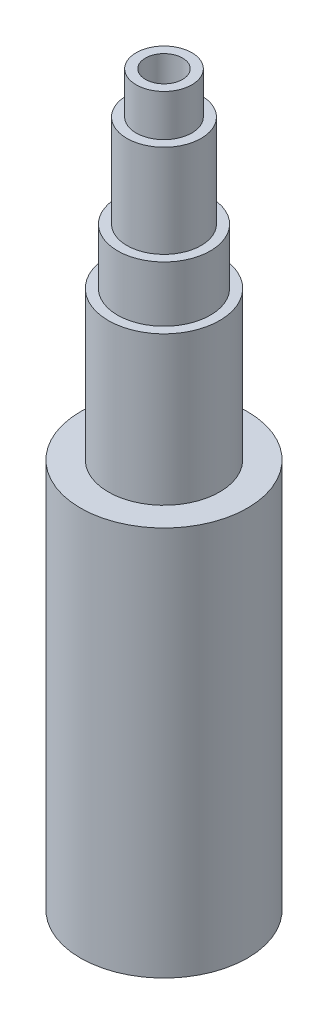
ISO-10303-21;
HEADER;
FILE_DESCRIPTION(('STEP AP214'),'2;1');
FILE_NAME('part.step','',(''),(''),'','','');
FILE_SCHEMA(('AUTOMOTIVE_DESIGN { 1 0 10303 214 1 1 1 1 }'));
ENDSEC;
DATA;
#1=APPLICATION_CONTEXT('core data for automotive mechanical design processes');
#2=APPLICATION_PROTOCOL_DEFINITION('international standard','automotive_design',2000,#1);
#3=PRODUCT_CONTEXT('',#1,'mechanical');
#4=PRODUCT('Part','Part','',(#3));
#5=PRODUCT_RELATED_PRODUCT_CATEGORY('part','',(#4));
#6=PRODUCT_DEFINITION_FORMATION('','',#4);
#7=PRODUCT_DEFINITION_CONTEXT('part definition',#1,'design');
#8=PRODUCT_DEFINITION('design','',#6,#7);
#9=PRODUCT_DEFINITION_SHAPE('','',#8);
#10=(LENGTH_UNIT() NAMED_UNIT(*) SI_UNIT(.MILLI.,.METRE.));
#11=(NAMED_UNIT(*) PLANE_ANGLE_UNIT() SI_UNIT($,.RADIAN.));
#12=(NAMED_UNIT(*) SI_UNIT($,.STERADIAN.) SOLID_ANGLE_UNIT());
#13=UNCERTAINTY_MEASURE_WITH_UNIT(LENGTH_MEASURE(1.E-05),#10,'distance_accuracy_value','');
#14=(GEOMETRIC_REPRESENTATION_CONTEXT(3) GLOBAL_UNCERTAINTY_ASSIGNED_CONTEXT((#13)) GLOBAL_UNIT_ASSIGNED_CONTEXT((#10,
#11,#12)) REPRESENTATION_CONTEXT('',''));
#15=CARTESIAN_POINT('',(0.,0.,0.));
#16=DIRECTION('',(0.,0.,1.));
#17=DIRECTION('',(1.,0.,0.));
#18=AXIS2_PLACEMENT_3D('',#15,#16,#17);
#19=CARTESIAN_POINT('',(0.,42.,0.));
#20=DIRECTION('',(0.,-1.,0.));
#21=DIRECTION('',(0.,0.,-1.));
#22=AXIS2_PLACEMENT_3D('',#19,#20,#21);
#23=CYLINDRICAL_SURFACE('',#22,9.);
#24=CARTESIAN_POINT('',(0.,42.,0.));
#25=DIRECTION('',(0.,1.,0.));
#26=DIRECTION('',(0.,0.,1.));
#27=AXIS2_PLACEMENT_3D('',#24,#25,#26);
#28=CIRCLE('',#27,9.);
#29=CARTESIAN_POINT('',(0.,42.,-9.));
#30=VERTEX_POINT('',#29);
#31=EDGE_CURVE('E10',#30,#30,#28,.T.);
#32=CARTESIAN_POINT('',(0.,0.,0.));
#33=DIRECTION('',(0.,1.,0.));
#34=DIRECTION('',(0.,0.,1.));
#35=AXIS2_PLACEMENT_3D('',#32,#33,#34);
#36=CIRCLE('',#35,9.);
#37=CARTESIAN_POINT('',(0.,0.,-9.));
#38=VERTEX_POINT('',#37);
#39=EDGE_CURVE('E36',#38,#38,#36,.T.);
#40=CARTESIAN_POINT('',(0.,42.,-9.));
#41=CARTESIAN_POINT('',(0.,41.5625,-9.));
#42=CARTESIAN_POINT('',(0.,41.125,-9.));
#43=CARTESIAN_POINT('',(0.,40.25,-9.));
#44=CARTESIAN_POINT('',(0.,39.8125,-9.));
#45=CARTESIAN_POINT('',(0.,38.9375,-9.));
#46=CARTESIAN_POINT('',(0.,38.5,-9.));
#47=CARTESIAN_POINT('',(0.,37.625,-9.));
#48=CARTESIAN_POINT('',(0.,37.1875,-9.));
#49=CARTESIAN_POINT('',(0.,36.3125,-9.));
#50=CARTESIAN_POINT('',(0.,35.875,-9.));
#51=CARTESIAN_POINT('',(0.,35.,-9.));
#52=CARTESIAN_POINT('',(0.,34.5625,-9.));
#53=CARTESIAN_POINT('',(0.,33.6875,-9.));
#54=CARTESIAN_POINT('',(0.,33.25,-9.));
#55=CARTESIAN_POINT('',(0.,32.375,-9.));
#56=CARTESIAN_POINT('',(0.,31.9375,-9.));
#57=CARTESIAN_POINT('',(0.,31.0625,-9.));
#58=CARTESIAN_POINT('',(0.,30.625,-9.));
#59=CARTESIAN_POINT('',(0.,29.75,-9.));
#60=CARTESIAN_POINT('',(0.,29.3125,-9.));
#61=CARTESIAN_POINT('',(0.,28.4375,-9.));
#62=CARTESIAN_POINT('',(0.,28.,-9.));
#63=CARTESIAN_POINT('',(0.,27.125,-9.));
#64=CARTESIAN_POINT('',(0.,26.6875,-9.));
#65=CARTESIAN_POINT('',(0.,25.8125,-9.));
#66=CARTESIAN_POINT('',(0.,25.375,-9.));
#67=CARTESIAN_POINT('',(0.,24.5,-9.));
#68=CARTESIAN_POINT('',(0.,24.0625,-9.));
#69=CARTESIAN_POINT('',(0.,23.1875,-9.));
#70=CARTESIAN_POINT('',(0.,22.75,-9.));
#71=CARTESIAN_POINT('',(0.,21.875,-9.));
#72=CARTESIAN_POINT('',(0.,21.4375,-9.));
#73=CARTESIAN_POINT('',(0.,20.5625,-9.));
#74=CARTESIAN_POINT('',(0.,20.125,-9.));
#75=CARTESIAN_POINT('',(0.,19.25,-9.));
#76=CARTESIAN_POINT('',(0.,18.8125,-9.));
#77=CARTESIAN_POINT('',(0.,17.9375,-9.));
#78=CARTESIAN_POINT('',(0.,17.5,-9.));
#79=CARTESIAN_POINT('',(0.,16.625,-9.));
#80=CARTESIAN_POINT('',(0.,16.1875,-9.));
#81=CARTESIAN_POINT('',(0.,15.3125,-9.));
#82=CARTESIAN_POINT('',(0.,14.875,-9.));
#83=CARTESIAN_POINT('',(0.,14.,-9.));
#84=CARTESIAN_POINT('',(0.,13.5625,-9.));
#85=CARTESIAN_POINT('',(0.,12.6875,-9.));
#86=CARTESIAN_POINT('',(0.,12.25,-9.));
#87=CARTESIAN_POINT('',(0.,11.375,-9.));
#88=CARTESIAN_POINT('',(0.,10.9375,-9.));
#89=CARTESIAN_POINT('',(0.,10.0625,-9.));
#90=CARTESIAN_POINT('',(0.,9.625,-9.));
#91=CARTESIAN_POINT('',(0.,8.75,-9.));
#92=CARTESIAN_POINT('',(0.,8.3125,-9.));
#93=CARTESIAN_POINT('',(0.,7.4375,-9.));
#94=CARTESIAN_POINT('',(0.,7.,-9.));
#95=CARTESIAN_POINT('',(0.,6.125,-9.));
#96=CARTESIAN_POINT('',(0.,5.6875,-9.));
#97=CARTESIAN_POINT('',(0.,4.8125,-9.));
#98=CARTESIAN_POINT('',(0.,4.375,-9.));
#99=CARTESIAN_POINT('',(0.,3.5,-9.));
#100=CARTESIAN_POINT('',(0.,3.0625,-9.));
#101=CARTESIAN_POINT('',(0.,2.1875,-9.));
#102=CARTESIAN_POINT('',(0.,1.75,-9.));
#103=CARTESIAN_POINT('',(0.,0.875000000000001,-9.));
#104=CARTESIAN_POINT('',(0.,0.4375,-9.));
#105=CARTESIAN_POINT('',(0.,0.,-9.));
#106=B_SPLINE_CURVE_WITH_KNOTS('',3,(#40,#41,#42,#43,#44,#45,#46,#47,#48,#49,#50,#51,#52,#53,
#54,#55,#56,#57,#58,#59,#60,#61,#62,#63,#64,#65,#66,#67,#68,#69,#70,#71,#72,#73,#74,#75,#76,#77,
#78,#79,#80,#81,#82,#83,#84,#85,#86,#87,#88,#89,#90,#91,#92,#93,#94,#95,#96,#97,#98,#99,#100,
#101,#102,#103,#104,#105),.UNSPECIFIED.,.F.,.F.,(4,2,2,2,2,2,2,2,2,2,2,2,2,2,2,2,2,2,2,2,2,2,2,
2,2,2,2,2,2,2,2,2,4),(0.,1.3125,2.625,3.9375,5.25,6.56250000000001,7.875,9.1875,10.5,11.8125,
13.125,14.4375,15.75,17.0625,18.375,19.6875,21.,22.3125,23.625,24.9375,26.25,27.5625,28.875,
30.1875,31.5,32.8125,34.125,35.4375,36.75,38.0625,39.375,40.6875,42.),.UNSPECIFIED.);
#107=EDGE_CURVE('BSEAM33',#30,#38,#106,.T.);
#108=ORIENTED_EDGE('',*,*,#31,.F.);
#109=ORIENTED_EDGE('',*,*,#39,.T.);
#110=ORIENTED_EDGE('',*,*,#107,.T.);
#111=ORIENTED_EDGE('',*,*,#107,.F.);
#112=EDGE_LOOP('',(#108,#110,#109,#111));
#113=FACE_BOUND('',#112,.T.);
#114=ADVANCED_FACE('F33',(#113),#23,.T.);
#115=CARTESIAN_POINT('',(0.,42.,0.));
#116=DIRECTION('',(0.,1.,0.));
#117=DIRECTION('',(0.,0.,1.));
#118=AXIS2_PLACEMENT_3D('',#115,#116,#117);
#119=PLANE('',#118);
#120=CARTESIAN_POINT('',(0.,42.,0.));
#121=DIRECTION('',(0.,1.,0.));
#122=DIRECTION('',(0.,0.,1.));
#123=AXIS2_PLACEMENT_3D('',#120,#121,#122);
#124=CIRCLE('',#123,6.);
#125=CARTESIAN_POINT('',(0.,42.,6.));
#126=VERTEX_POINT('',#125);
#127=EDGE_CURVE('E45',#126,#126,#124,.T.);
#128=ORIENTED_EDGE('',*,*,#127,.F.);
#129=EDGE_LOOP('',(#128));
#130=FACE_BOUND('',#129,.T.);
#131=ORIENTED_EDGE('',*,*,#31,.T.);
#132=EDGE_LOOP('',(#131));
#133=FACE_BOUND('',#132,.T.);
#134=ADVANCED_FACE('F94',(#130,#133),#119,.T.);
#135=CARTESIAN_POINT('',(0.,0.,0.));
#136=DIRECTION('',(0.,1.,0.));
#137=DIRECTION('',(0.,0.,1.));
#138=AXIS2_PLACEMENT_3D('',#135,#136,#137);
#139=PLANE('',#138);
#140=CARTESIAN_POINT('',(0.,0.,0.));
#141=DIRECTION('',(0.,-1.,0.));
#142=DIRECTION('',(0.,0.,-1.));
#143=AXIS2_PLACEMENT_3D('',#140,#141,#142);
#144=CIRCLE('',#143,4.);
#145=CARTESIAN_POINT('',(0.,0.,-4.));
#146=VERTEX_POINT('',#145);
#147=EDGE_CURVE('E75',#146,#146,#144,.T.);
#148=ORIENTED_EDGE('',*,*,#147,.F.);
#149=EDGE_LOOP('',(#148));
#150=FACE_BOUND('',#149,.T.);
#151=ORIENTED_EDGE('',*,*,#39,.F.);
#152=EDGE_LOOP('',(#151));
#153=FACE_BOUND('',#152,.T.);
#154=ADVANCED_FACE('F90',(#150,#153),#139,.F.);
#155=CARTESIAN_POINT('',(0.,58.,0.));
#156=DIRECTION('',(0.,-1.,0.));
#157=DIRECTION('',(0.,0.,-1.));
#158=AXIS2_PLACEMENT_3D('',#155,#156,#157);
#159=CYLINDRICAL_SURFACE('',#158,6.);
#160=CARTESIAN_POINT('',(0.,58.,0.));
#161=DIRECTION('',(0.,1.,0.));
#162=DIRECTION('',(0.,0.,1.));
#163=AXIS2_PLACEMENT_3D('',#160,#161,#162);
#164=CIRCLE('',#163,6.);
#165=CARTESIAN_POINT('',(0.,58.,6.));
#166=VERTEX_POINT('',#165);
#167=EDGE_CURVE('E43',#166,#166,#164,.T.);
#168=ORIENTED_EDGE('',*,*,#167,.F.);
#169=EDGE_LOOP('',(#168));
#170=FACE_BOUND('',#169,.T.);
#171=ORIENTED_EDGE('',*,*,#127,.T.);
#172=EDGE_LOOP('',(#171));
#173=FACE_BOUND('',#172,.T.);
#174=ADVANCED_FACE('F93',(#170,#173),#159,.T.);
#175=CARTESIAN_POINT('',(0.,58.,0.));
#176=DIRECTION('',(0.,1.,0.));
#177=DIRECTION('',(0.,0.,1.));
#178=AXIS2_PLACEMENT_3D('',#175,#176,#177);
#179=PLANE('',#178);
#180=CARTESIAN_POINT('',(0.,58.,0.));
#181=DIRECTION('',(0.,1.,0.));
#182=DIRECTION('',(0.,0.,1.));
#183=AXIS2_PLACEMENT_3D('',#180,#181,#182);
#184=CIRCLE('',#183,5.);
#185=CARTESIAN_POINT('',(0.,58.,5.));
#186=VERTEX_POINT('',#185);
#187=EDGE_CURVE('E51',#186,#186,#184,.T.);
#188=ORIENTED_EDGE('',*,*,#187,.F.);
#189=EDGE_LOOP('',(#188));
#190=FACE_BOUND('',#189,.T.);
#191=ORIENTED_EDGE('',*,*,#167,.T.);
#192=EDGE_LOOP('',(#191));
#193=FACE_BOUND('',#192,.T.);
#194=ADVANCED_FACE('F110',(#190,#193),#179,.T.);
#195=CARTESIAN_POINT('',(0.,64.,0.));
#196=DIRECTION('',(0.,-1.,0.));
#197=DIRECTION('',(0.,0.,-1.));
#198=AXIS2_PLACEMENT_3D('',#195,#196,#197);
#199=CYLINDRICAL_SURFACE('',#198,5.);
#200=CARTESIAN_POINT('',(0.,64.,0.));
#201=DIRECTION('',(0.,1.,0.));
#202=DIRECTION('',(0.,0.,1.));
#203=AXIS2_PLACEMENT_3D('',#200,#201,#202);
#204=CIRCLE('',#203,5.);
#205=CARTESIAN_POINT('',(0.,64.,5.));
#206=VERTEX_POINT('',#205);
#207=EDGE_CURVE('E48',#206,#206,#204,.T.);
#208=ORIENTED_EDGE('',*,*,#207,.F.);
#209=EDGE_LOOP('',(#208));
#210=FACE_BOUND('',#209,.T.);
#211=ORIENTED_EDGE('',*,*,#187,.T.);
#212=EDGE_LOOP('',(#211));
#213=FACE_BOUND('',#212,.T.);
#214=ADVANCED_FACE('F114',(#210,#213),#199,.T.);
#215=CARTESIAN_POINT('',(0.,64.,0.));
#216=DIRECTION('',(0.,1.,0.));
#217=DIRECTION('',(0.,0.,1.));
#218=AXIS2_PLACEMENT_3D('',#215,#216,#217);
#219=PLANE('',#218);
#220=CARTESIAN_POINT('',(0.,64.,0.));
#221=DIRECTION('',(0.,1.,0.));
#222=DIRECTION('',(0.,0.,1.));
#223=AXIS2_PLACEMENT_3D('',#220,#221,#222);
#224=CIRCLE('',#223,4.);
#225=CARTESIAN_POINT('',(0.,64.,4.));
#226=VERTEX_POINT('',#225);
#227=EDGE_CURVE('E57',#226,#226,#224,.T.);
#228=ORIENTED_EDGE('',*,*,#227,.F.);
#229=EDGE_LOOP('',(#228));
#230=FACE_BOUND('',#229,.T.);
#231=ORIENTED_EDGE('',*,*,#207,.T.);
#232=EDGE_LOOP('',(#231));
#233=FACE_BOUND('',#232,.T.);
#234=ADVANCED_FACE('F118',(#230,#233),#219,.T.);
#235=CARTESIAN_POINT('',(0.,74.,0.));
#236=DIRECTION('',(0.,-1.,0.));
#237=DIRECTION('',(0.,0.,-1.));
#238=AXIS2_PLACEMENT_3D('',#235,#236,#237);
#239=CYLINDRICAL_SURFACE('',#238,4.);
#240=CARTESIAN_POINT('',(0.,74.,0.));
#241=DIRECTION('',(0.,1.,0.));
#242=DIRECTION('',(0.,0.,1.));
#243=AXIS2_PLACEMENT_3D('',#240,#241,#242);
#244=CIRCLE('',#243,4.);
#245=CARTESIAN_POINT('',(0.,74.,4.));
#246=VERTEX_POINT('',#245);
#247=EDGE_CURVE('E54',#246,#246,#244,.T.);
#248=ORIENTED_EDGE('',*,*,#247,.F.);
#249=EDGE_LOOP('',(#248));
#250=FACE_BOUND('',#249,.T.);
#251=ORIENTED_EDGE('',*,*,#227,.T.);
#252=EDGE_LOOP('',(#251));
#253=FACE_BOUND('',#252,.T.);
#254=ADVANCED_FACE('F122',(#250,#253),#239,.T.);
#255=CARTESIAN_POINT('',(0.,74.,0.));
#256=DIRECTION('',(0.,1.,0.));
#257=DIRECTION('',(0.,0.,1.));
#258=AXIS2_PLACEMENT_3D('',#255,#256,#257);
#259=PLANE('',#258);
#260=CARTESIAN_POINT('',(0.,74.,0.));
#261=DIRECTION('',(0.,1.,0.));
#262=DIRECTION('',(0.,0.,1.));
#263=AXIS2_PLACEMENT_3D('',#260,#261,#262);
#264=CIRCLE('',#263,3.);
#265=CARTESIAN_POINT('',(0.,74.,3.));
#266=VERTEX_POINT('',#265);
#267=EDGE_CURVE('E63',#266,#266,#264,.T.);
#268=ORIENTED_EDGE('',*,*,#267,.F.);
#269=EDGE_LOOP('',(#268));
#270=FACE_BOUND('',#269,.T.);
#271=ORIENTED_EDGE('',*,*,#247,.T.);
#272=EDGE_LOOP('',(#271));
#273=FACE_BOUND('',#272,.T.);
#274=ADVANCED_FACE('F126',(#270,#273),#259,.T.);
#275=CARTESIAN_POINT('',(0.,78.5,0.));
#276=DIRECTION('',(0.,-1.,0.));
#277=DIRECTION('',(0.,0.,-1.));
#278=AXIS2_PLACEMENT_3D('',#275,#276,#277);
#279=CYLINDRICAL_SURFACE('',#278,3.);
#280=CARTESIAN_POINT('',(0.,78.5,0.));
#281=DIRECTION('',(0.,1.,0.));
#282=DIRECTION('',(0.,0.,1.));
#283=AXIS2_PLACEMENT_3D('',#280,#281,#282);
#284=CIRCLE('',#283,3.);
#285=CARTESIAN_POINT('',(0.,78.5,3.));
#286=VERTEX_POINT('',#285);
#287=EDGE_CURVE('E60',#286,#286,#284,.T.);
#288=ORIENTED_EDGE('',*,*,#287,.F.);
#289=EDGE_LOOP('',(#288));
#290=FACE_BOUND('',#289,.T.);
#291=ORIENTED_EDGE('',*,*,#267,.T.);
#292=EDGE_LOOP('',(#291));
#293=FACE_BOUND('',#292,.T.);
#294=ADVANCED_FACE('F130',(#290,#293),#279,.T.);
#295=CARTESIAN_POINT('',(0.,78.5,0.));
#296=DIRECTION('',(0.,1.,0.));
#297=DIRECTION('',(0.,0.,1.));
#298=AXIS2_PLACEMENT_3D('',#295,#296,#297);
#299=PLANE('',#298);
#300=CARTESIAN_POINT('',(0.,78.5,0.));
#301=DIRECTION('',(0.,1.,0.));
#302=DIRECTION('',(0.,0.,1.));
#303=AXIS2_PLACEMENT_3D('',#300,#301,#302);
#304=CIRCLE('',#303,2.);
#305=CARTESIAN_POINT('',(0.,78.5,2.));
#306=VERTEX_POINT('',#305);
#307=EDGE_CURVE('E69',#306,#306,#304,.T.);
#308=ORIENTED_EDGE('',*,*,#307,.F.);
#309=EDGE_LOOP('',(#308));
#310=FACE_BOUND('',#309,.T.);
#311=ORIENTED_EDGE('',*,*,#287,.T.);
#312=EDGE_LOOP('',(#311));
#313=FACE_BOUND('',#312,.T.);
#314=ADVANCED_FACE('F134',(#310,#313),#299,.T.);
#315=CARTESIAN_POINT('',(0.,68.5,0.));
#316=DIRECTION('',(0.,1.,0.));
#317=DIRECTION('',(0.,0.,1.));
#318=AXIS2_PLACEMENT_3D('',#315,#316,#317);
#319=CYLINDRICAL_SURFACE('',#318,2.);
#320=CARTESIAN_POINT('',(0.,68.5,0.));
#321=DIRECTION('',(0.,1.,0.));
#322=DIRECTION('',(0.,0.,1.));
#323=AXIS2_PLACEMENT_3D('',#320,#321,#322);
#324=CIRCLE('',#323,2.);
#325=CARTESIAN_POINT('',(0.,68.5,2.));
#326=VERTEX_POINT('',#325);
#327=EDGE_CURVE('E66',#326,#326,#324,.T.);
#328=ORIENTED_EDGE('',*,*,#327,.F.);
#329=EDGE_LOOP('',(#328));
#330=FACE_BOUND('',#329,.T.);
#331=ORIENTED_EDGE('',*,*,#307,.T.);
#332=EDGE_LOOP('',(#331));
#333=FACE_BOUND('',#332,.T.);
#334=ADVANCED_FACE('F138',(#330,#333),#319,.F.);
#335=CARTESIAN_POINT('',(0.,68.5,0.));
#336=DIRECTION('',(0.,1.,0.));
#337=DIRECTION('',(0.,0.,1.));
#338=AXIS2_PLACEMENT_3D('',#335,#336,#337);
#339=PLANE('',#338);
#340=ORIENTED_EDGE('',*,*,#327,.T.);
#341=EDGE_LOOP('',(#340));
#342=FACE_BOUND('',#341,.T.);
#343=ADVANCED_FACE('F86',(#342),#339,.T.);
#344=CARTESIAN_POINT('',(0.,32.,0.));
#345=DIRECTION('',(0.,-1.,0.));
#346=DIRECTION('',(0.,0.,-1.));
#347=AXIS2_PLACEMENT_3D('',#344,#345,#346);
#348=CYLINDRICAL_SURFACE('',#347,4.);
#349=CARTESIAN_POINT('',(0.,32.,0.));
#350=DIRECTION('',(0.,-1.,0.));
#351=DIRECTION('',(0.,0.,-1.));
#352=AXIS2_PLACEMENT_3D('',#349,#350,#351);
#353=CIRCLE('',#352,4.);
#354=CARTESIAN_POINT('',(0.,32.,-4.));
#355=VERTEX_POINT('',#354);
#356=EDGE_CURVE('E72',#355,#355,#353,.T.);
#357=ORIENTED_EDGE('',*,*,#356,.F.);
#358=EDGE_LOOP('',(#357));
#359=FACE_BOUND('',#358,.T.);
#360=ORIENTED_EDGE('',*,*,#147,.T.);
#361=EDGE_LOOP('',(#360));
#362=FACE_BOUND('',#361,.T.);
#363=ADVANCED_FACE('F83',(#359,#362),#348,.F.);
#364=CARTESIAN_POINT('',(0.,32.,0.));
#365=DIRECTION('',(0.,-1.,0.));
#366=DIRECTION('',(0.,0.,-1.));
#367=AXIS2_PLACEMENT_3D('',#364,#365,#366);
#368=PLANE('',#367);
#369=ORIENTED_EDGE('',*,*,#356,.T.);
#370=EDGE_LOOP('',(#369));
#371=FACE_BOUND('',#370,.T.);
#372=ADVANCED_FACE('F81',(#371),#368,.T.);
#373=CLOSED_SHELL('',(#114,#134,#154,#174,#194,#214,#234,#254,#274,#294,#314,#334,#343,#363,#372));
#374=MANIFOLD_SOLID_BREP('B2',#373);
#375=ADVANCED_BREP_SHAPE_REPRESENTATION('',(#18,#374),#14);
#376=SHAPE_DEFINITION_REPRESENTATION(#9,#375);
ENDSEC;
END-ISO-10303-21;
